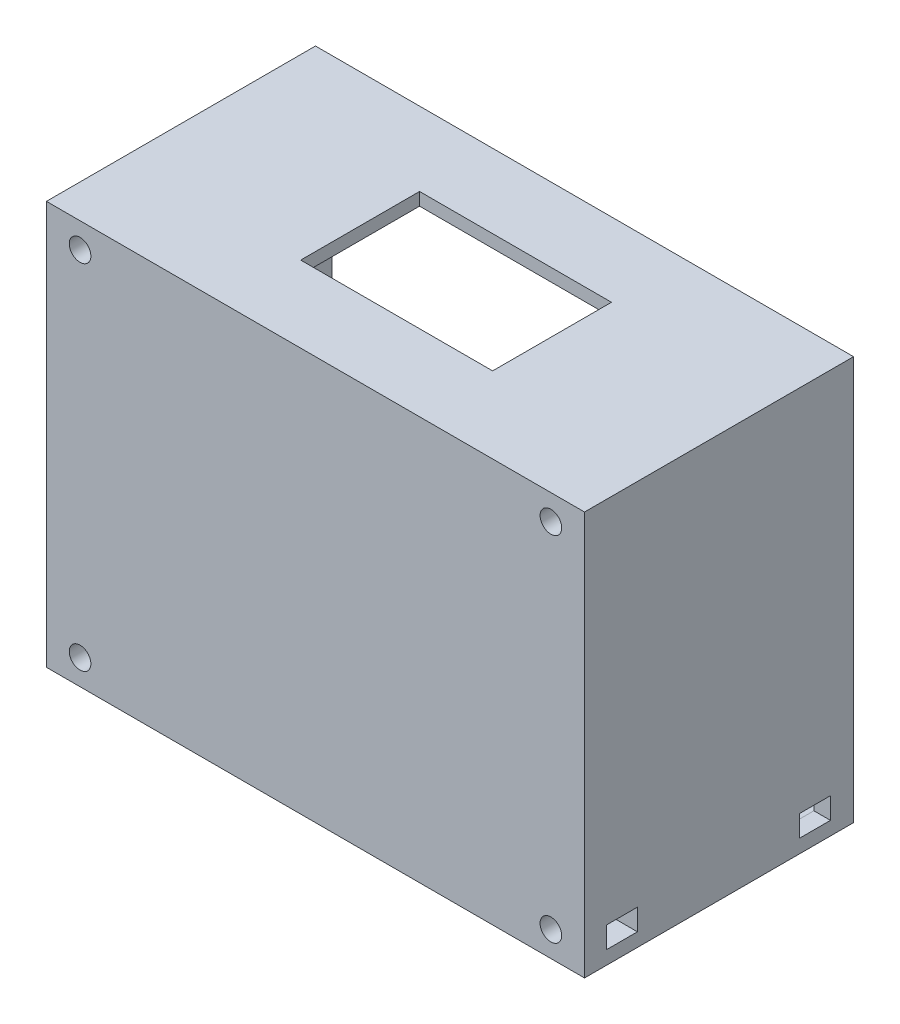
ISO-10303-21;
HEADER;
FILE_DESCRIPTION(('STEP AP214'),'2;1');
FILE_NAME('part.step','',(''),(''),'','','');
FILE_SCHEMA(('AUTOMOTIVE_DESIGN { 1 0 10303 214 1 1 1 1 }'));
ENDSEC;
DATA;
#1=APPLICATION_CONTEXT('core data for automotive mechanical design processes');
#2=APPLICATION_PROTOCOL_DEFINITION('international standard','automotive_design',2000,#1);
#3=PRODUCT_CONTEXT('',#1,'mechanical');
#4=PRODUCT('Part','Part','',(#3));
#5=PRODUCT_RELATED_PRODUCT_CATEGORY('part','',(#4));
#6=PRODUCT_DEFINITION_FORMATION('','',#4);
#7=PRODUCT_DEFINITION_CONTEXT('part definition',#1,'design');
#8=PRODUCT_DEFINITION('design','',#6,#7);
#9=PRODUCT_DEFINITION_SHAPE('','',#8);
#10=(LENGTH_UNIT() NAMED_UNIT(*) SI_UNIT(.MILLI.,.METRE.));
#11=(NAMED_UNIT(*) PLANE_ANGLE_UNIT() SI_UNIT($,.RADIAN.));
#12=(NAMED_UNIT(*) SI_UNIT($,.STERADIAN.) SOLID_ANGLE_UNIT());
#13=UNCERTAINTY_MEASURE_WITH_UNIT(LENGTH_MEASURE(1.E-05),#10,'distance_accuracy_value','');
#14=(GEOMETRIC_REPRESENTATION_CONTEXT(3) GLOBAL_UNCERTAINTY_ASSIGNED_CONTEXT((#13)) GLOBAL_UNIT_ASSIGNED_CONTEXT((#10,
#11,#12)) REPRESENTATION_CONTEXT('',''));
#15=CARTESIAN_POINT('',(0.,0.,0.));
#16=DIRECTION('',(0.,0.,1.));
#17=DIRECTION('',(1.,0.,0.));
#18=AXIS2_PLACEMENT_3D('',#15,#16,#17);
#19=CARTESIAN_POINT('',(100.,-75.,100.));
#20=DIRECTION('',(-1.,0.,0.));
#21=DIRECTION('',(0.,-1.,0.));
#22=AXIS2_PLACEMENT_3D('',#19,#20,#21);
#23=PLANE('',#22);
#24=DIRECTION('',(0.,-1.,0.));
#25=VECTOR('',#24,1.);
#26=CARTESIAN_POINT('',(100.,-75.,20.0891377684117));
#27=LINE('',#26,#25);
#28=CARTESIAN_POINT('',(100.,-62.0179765850764,20.0891377684117));
#29=VERTEX_POINT('',#28);
#30=CARTESIAN_POINT('',(100.,-69.9663175976663,20.0891377684117));
#31=VERTEX_POINT('',#30);
#32=EDGE_CURVE('E285',#29,#31,#27,.T.);
#33=ORIENTED_EDGE('',*,*,#32,.F.);
#34=DIRECTION('',(0.,0.,1.));
#35=VECTOR('',#34,1.);
#36=CARTESIAN_POINT('',(100.,-62.0179765850764,100.));
#37=LINE('',#36,#35);
#38=CARTESIAN_POINT('',(100.,-62.0179765850764,8.58495998703163));
#39=VERTEX_POINT('',#38);
#40=EDGE_CURVE('E269',#39,#29,#37,.T.);
#41=ORIENTED_EDGE('',*,*,#40,.F.);
#42=DIRECTION('',(0.,1.,0.));
#43=VECTOR('',#42,1.);
#44=CARTESIAN_POINT('',(100.,-75.,8.58495998703163));
#45=LINE('',#44,#43);
#46=CARTESIAN_POINT('',(100.,-69.9663175976663,8.58495998703163));
#47=VERTEX_POINT('',#46);
#48=EDGE_CURVE('E280',#47,#39,#45,.T.);
#49=ORIENTED_EDGE('',*,*,#48,.F.);
#50=DIRECTION('',(0.,0.,-1.));
#51=VECTOR('',#50,1.);
#52=CARTESIAN_POINT('',(100.,-69.9663175976663,100.));
#53=LINE('',#52,#51);
#54=EDGE_CURVE('E283',#31,#47,#53,.T.);
#55=ORIENTED_EDGE('',*,*,#54,.F.);
#56=EDGE_LOOP('',(#33,#41,#49,#55));
#57=FACE_BOUND('',#56,.T.);
#58=DIRECTION('',(0.,1.,0.));
#59=VECTOR('',#58,1.);
#60=CARTESIAN_POINT('',(100.,-75.,0.));
#61=LINE('',#60,#59);
#62=CARTESIAN_POINT('',(100.,-75.,0.));
#63=VERTEX_POINT('',#62);
#64=CARTESIAN_POINT('',(99.9999999999999,75.,0.));
#65=VERTEX_POINT('',#64);
#66=EDGE_CURVE('E396',#63,#65,#61,.T.);
#67=ORIENTED_EDGE('',*,*,#66,.T.);
#68=DIRECTION('',(0.,0.,-1.));
#69=VECTOR('',#68,1.);
#70=CARTESIAN_POINT('',(99.9999999999999,75.,100.));
#71=LINE('',#70,#69);
#72=CARTESIAN_POINT('',(99.9999999999999,75.,100.));
#73=VERTEX_POINT('',#72);
#74=EDGE_CURVE('E401',#73,#65,#71,.T.);
#75=ORIENTED_EDGE('',*,*,#74,.F.);
#76=DIRECTION('',(0.,1.,0.));
#77=VECTOR('',#76,1.);
#78=CARTESIAN_POINT('',(100.,-75.,100.));
#79=LINE('',#78,#77);
#80=CARTESIAN_POINT('',(100.,-75.,100.));
#81=VERTEX_POINT('',#80);
#82=EDGE_CURVE('E387',#81,#73,#79,.T.);
#83=ORIENTED_EDGE('',*,*,#82,.F.);
#84=DIRECTION('',(0.,0.,-1.));
#85=VECTOR('',#84,1.);
#86=CARTESIAN_POINT('',(100.,-75.,100.));
#87=LINE('',#86,#85);
#88=EDGE_CURVE('E404',#81,#63,#87,.T.);
#89=ORIENTED_EDGE('',*,*,#88,.T.);
#90=EDGE_LOOP('',(#67,#75,#83,#89));
#91=FACE_BOUND('',#90,.T.);
#92=DIRECTION('',(0.,-1.,0.));
#93=VECTOR('',#92,1.);
#94=CARTESIAN_POINT('',(100.,-75.,91.833373750473));
#95=LINE('',#94,#93);
#96=CARTESIAN_POINT('',(100.,-62.0179765850764,91.833373750473));
#97=VERTEX_POINT('',#96);
#98=CARTESIAN_POINT('',(100.,-69.9663175976663,91.833373750473));
#99=VERTEX_POINT('',#98);
#100=EDGE_CURVE('E292',#97,#99,#95,.T.);
#101=ORIENTED_EDGE('',*,*,#100,.F.);
#102=DIRECTION('',(0.,0.,1.));
#103=VECTOR('',#102,1.);
#104=CARTESIAN_POINT('',(100.,-62.0179765850764,100.));
#105=LINE('',#104,#103);
#106=CARTESIAN_POINT('',(100.,-62.0179765850764,80.329195969093));
#107=VERTEX_POINT('',#106);
#108=EDGE_CURVE('E287',#107,#97,#105,.T.);
#109=ORIENTED_EDGE('',*,*,#108,.F.);
#110=DIRECTION('',(0.,1.,0.));
#111=VECTOR('',#110,1.);
#112=CARTESIAN_POINT('',(100.,-75.,80.329195969093));
#113=LINE('',#112,#111);
#114=CARTESIAN_POINT('',(100.,-69.9663175976663,80.329195969093));
#115=VERTEX_POINT('',#114);
#116=EDGE_CURVE('E289',#115,#107,#113,.T.);
#117=ORIENTED_EDGE('',*,*,#116,.F.);
#118=DIRECTION('',(0.,0.,-1.));
#119=VECTOR('',#118,1.);
#120=CARTESIAN_POINT('',(100.,-69.9663175976663,100.));
#121=LINE('',#120,#119);
#122=EDGE_CURVE('E448',#99,#115,#121,.T.);
#123=ORIENTED_EDGE('',*,*,#122,.F.);
#124=EDGE_LOOP('',(#101,#109,#117,#123));
#125=FACE_BOUND('',#124,.T.);
#126=ADVANCED_FACE('F33',(#57,#91,#125),#23,.F.);
#127=CARTESIAN_POINT('',(87.5007308465081,-65.625548134881,100.));
#128=DIRECTION('',(0.,0.,-1.));
#129=DIRECTION('',(-1.,0.,0.));
#130=AXIS2_PLACEMENT_3D('',#127,#128,#129);
#131=CYLINDRICAL_SURFACE('',#130,4.0159317030488);
#132=CARTESIAN_POINT('',(87.5007308465081,-65.625548134881,80.));
#133=DIRECTION('',(0.,0.,1.));
#134=DIRECTION('',(1.,0.,0.));
#135=AXIS2_PLACEMENT_3D('',#132,#133,#134);
#136=CIRCLE('',#135,4.0159317030488);
#137=CARTESIAN_POINT('',(91.5166625495569,-65.625548134881,80.));
#138=VERTEX_POINT('',#137);
#139=EDGE_CURVE('E358',#138,#138,#136,.T.);
#140=ORIENTED_EDGE('',*,*,#139,.F.);
#141=EDGE_LOOP('',(#140));
#142=FACE_BOUND('',#141,.T.);
#143=CARTESIAN_POINT('',(87.5007308465081,-65.625548134881,100.));
#144=DIRECTION('',(0.,0.,1.));
#145=DIRECTION('',(1.,0.,0.));
#146=AXIS2_PLACEMENT_3D('',#143,#144,#145);
#147=CIRCLE('',#146,4.0159317030488);
#148=CARTESIAN_POINT('',(91.5166625495569,-65.625548134881,100.));
#149=VERTEX_POINT('',#148);
#150=EDGE_CURVE('E368',#149,#149,#147,.T.);
#151=ORIENTED_EDGE('',*,*,#150,.T.);
#152=EDGE_LOOP('',(#151));
#153=FACE_BOUND('',#152,.T.);
#154=CARTESIAN_POINT('',(87.5007308465081,-65.625548134881,91.833373750473));
#155=DIRECTION('',(0.,0.,-1.));
#156=DIRECTION('',(-1.,0.,0.));
#157=AXIS2_PLACEMENT_3D('',#154,#155,#156);
#158=CIRCLE('',#157,4.0159317030488);
#159=CARTESIAN_POINT('',(89.2651386668808,-62.0179765850764,91.833373750473));
#160=VERTEX_POINT('',#159);
#161=CARTESIAN_POINT('',(85.7363230261354,-62.0179765850764,91.833373750473));
#162=VERTEX_POINT('',#161);
#163=EDGE_CURVE('E442',#160,#162,#158,.T.);
#164=ORIENTED_EDGE('',*,*,#163,.T.);
#165=DIRECTION('',(0.,0.,-1.));
#166=VECTOR('',#165,1.);
#167=CARTESIAN_POINT('',(85.7363230261354,-62.0179765850764,100.));
#168=LINE('',#167,#166);
#169=CARTESIAN_POINT('',(85.7363230261354,-62.0179765850764,80.329195969093));
#170=VERTEX_POINT('',#169);
#171=EDGE_CURVE('E445',#162,#170,#168,.T.);
#172=ORIENTED_EDGE('',*,*,#171,.T.);
#173=CARTESIAN_POINT('',(87.5007308465081,-65.625548134881,80.329195969093));
#174=DIRECTION('',(0.,0.,1.));
#175=DIRECTION('',(1.,0.,0.));
#176=AXIS2_PLACEMENT_3D('',#173,#174,#175);
#177=CIRCLE('',#176,4.0159317030488);
#178=CARTESIAN_POINT('',(89.2651386668808,-62.0179765850764,80.329195969093));
#179=VERTEX_POINT('',#178);
#180=EDGE_CURVE('E439',#170,#179,#177,.T.);
#181=ORIENTED_EDGE('',*,*,#180,.T.);
#182=DIRECTION('',(0.,0.,-1.));
#183=VECTOR('',#182,1.);
#184=CARTESIAN_POINT('',(89.2651386668808,-62.0179765850764,100.));
#185=LINE('',#184,#183);
#186=EDGE_CURVE('E436',#179,#160,#185,.F.);
#187=ORIENTED_EDGE('',*,*,#186,.T.);
#188=EDGE_LOOP('',(#164,#172,#181,#187));
#189=FACE_BOUND('',#188,.T.);
#190=ADVANCED_FACE('F474',(#142,#153,#189),#131,.F.);
#191=CARTESIAN_POINT('',(93.8350179720571,-70.2651693113456,80.));
#192=DIRECTION('',(-1.,0.,0.));
#193=DIRECTION('',(0.,0.,1.));
#194=AXIS2_PLACEMENT_3D('',#191,#192,#193);
#195=PLANE('',#194);
#196=DIRECTION('',(0.,1.,0.));
#197=VECTOR('',#196,1.);
#198=CARTESIAN_POINT('',(93.8350179720571,-70.2651693113456,0.));
#199=LINE('',#198,#197);
#200=CARTESIAN_POINT('',(93.8350179720571,-70.2651693113456,0.));
#201=VERTEX_POINT('',#200);
#202=CARTESIAN_POINT('',(93.8350179720571,70.2651693113456,0.));
#203=VERTEX_POINT('',#202);
#204=EDGE_CURVE('E343',#201,#203,#199,.T.);
#205=ORIENTED_EDGE('',*,*,#204,.F.);
#206=DIRECTION('',(0.,0.,-1.));
#207=VECTOR('',#206,1.);
#208=CARTESIAN_POINT('',(93.8350179720571,-70.2651693113456,80.));
#209=LINE('',#208,#207);
#210=CARTESIAN_POINT('',(93.8350179720571,-70.2651693113456,80.));
#211=VERTEX_POINT('',#210);
#212=EDGE_CURVE('E352',#211,#201,#209,.T.);
#213=ORIENTED_EDGE('',*,*,#212,.F.);
#214=DIRECTION('',(0.,1.,0.));
#215=VECTOR('',#214,1.);
#216=CARTESIAN_POINT('',(93.8350179720571,-70.2651693113456,80.));
#217=LINE('',#216,#215);
#218=CARTESIAN_POINT('',(93.8350179720571,70.2651693113456,80.));
#219=VERTEX_POINT('',#218);
#220=EDGE_CURVE('E333',#211,#219,#217,.T.);
#221=ORIENTED_EDGE('',*,*,#220,.T.);
#222=DIRECTION('',(0.,0.,-1.));
#223=VECTOR('',#222,1.);
#224=CARTESIAN_POINT('',(93.8350179720571,70.2651693113456,80.));
#225=LINE('',#224,#223);
#226=EDGE_CURVE('E350',#219,#203,#225,.T.);
#227=ORIENTED_EDGE('',*,*,#226,.T.);
#228=EDGE_LOOP('',(#205,#213,#221,#227));
#229=FACE_BOUND('',#228,.T.);
#230=DIRECTION('',(0.,0.,1.));
#231=VECTOR('',#230,1.);
#232=CARTESIAN_POINT('',(93.8350179720571,-62.0179765850764,80.));
#233=LINE('',#232,#231);
#234=CARTESIAN_POINT('',(93.8350179720571,-62.0179765850764,8.58495998703163));
#235=VERTEX_POINT('',#234);
#236=CARTESIAN_POINT('',(93.8350179720571,-62.0179765850764,20.0891377684117));
#237=VERTEX_POINT('',#236);
#238=EDGE_CURVE('E424',#235,#237,#233,.T.);
#239=ORIENTED_EDGE('',*,*,#238,.T.);
#240=DIRECTION('',(0.,-1.,0.));
#241=VECTOR('',#240,1.);
#242=CARTESIAN_POINT('',(93.8350179720571,-70.2651693113456,20.0891377684117));
#243=LINE('',#242,#241);
#244=CARTESIAN_POINT('',(93.8350179720571,-69.9663175976663,20.0891377684117));
#245=VERTEX_POINT('',#244);
#246=EDGE_CURVE('E433',#237,#245,#243,.T.);
#247=ORIENTED_EDGE('',*,*,#246,.T.);
#248=DIRECTION('',(0.,0.,-1.));
#249=VECTOR('',#248,1.);
#250=CARTESIAN_POINT('',(93.8350179720571,-69.9663175976663,80.));
#251=LINE('',#250,#249);
#252=CARTESIAN_POINT('',(93.8350179720571,-69.9663175976663,8.58495998703163));
#253=VERTEX_POINT('',#252);
#254=EDGE_CURVE('E430',#245,#253,#251,.T.);
#255=ORIENTED_EDGE('',*,*,#254,.T.);
#256=DIRECTION('',(0.,1.,0.));
#257=VECTOR('',#256,1.);
#258=CARTESIAN_POINT('',(93.8350179720571,-70.2651693113456,8.58495998703163));
#259=LINE('',#258,#257);
#260=EDGE_CURVE('E427',#253,#235,#259,.T.);
#261=ORIENTED_EDGE('',*,*,#260,.T.);
#262=EDGE_LOOP('',(#239,#247,#255,#261));
#263=FACE_BOUND('',#262,.T.);
#264=ADVANCED_FACE('F480',(#229,#263),#195,.T.);
#265=CARTESIAN_POINT('',(0.,0.,0.));
#266=DIRECTION('',(0.,0.,1.));
#267=DIRECTION('',(1.,0.,0.));
#268=AXIS2_PLACEMENT_3D('',#265,#266,#267);
#269=PLANE('',#268);
#270=DIRECTION('',(0.,-1.,0.));
#271=VECTOR('',#270,1.);
#272=CARTESIAN_POINT('',(-100.,-75.,0.));
#273=LINE('',#272,#271);
#274=CARTESIAN_POINT('',(-100.,75.,0.));
#275=VERTEX_POINT('',#274);
#276=CARTESIAN_POINT('',(-100.,-75.,0.));
#277=VERTEX_POINT('',#276);
#278=EDGE_CURVE('E380',#275,#277,#273,.T.);
#279=ORIENTED_EDGE('',*,*,#278,.F.);
#280=DIRECTION('',(-1.,0.,0.));
#281=VECTOR('',#280,1.);
#282=CARTESIAN_POINT('',(99.9999999999999,75.,0.));
#283=LINE('',#282,#281);
#284=EDGE_CURVE('E385',#65,#275,#283,.T.);
#285=ORIENTED_EDGE('',*,*,#284,.F.);
#286=ORIENTED_EDGE('',*,*,#66,.F.);
#287=DIRECTION('',(1.,0.,0.));
#288=VECTOR('',#287,1.);
#289=CARTESIAN_POINT('',(100.,-75.,0.));
#290=LINE('',#289,#288);
#291=EDGE_CURVE('E394',#277,#63,#290,.T.);
#292=ORIENTED_EDGE('',*,*,#291,.F.);
#293=EDGE_LOOP('',(#279,#285,#286,#292));
#294=FACE_BOUND('',#293,.T.);
#295=DIRECTION('',(0.,-1.,0.));
#296=VECTOR('',#295,1.);
#297=CARTESIAN_POINT('',(-93.8350179720571,-70.2651693113456,0.));
#298=LINE('',#297,#296);
#299=CARTESIAN_POINT('',(-93.8350179720571,70.2651693113456,0.));
#300=VERTEX_POINT('',#299);
#301=CARTESIAN_POINT('',(-93.8350179720571,-70.2651693113456,0.));
#302=VERTEX_POINT('',#301);
#303=EDGE_CURVE('E326',#300,#302,#298,.T.);
#304=ORIENTED_EDGE('',*,*,#303,.T.);
#305=DIRECTION('',(1.,0.,0.));
#306=VECTOR('',#305,1.);
#307=CARTESIAN_POINT('',(93.8350179720571,-70.2651693113456,0.));
#308=LINE('',#307,#306);
#309=EDGE_CURVE('E340',#302,#201,#308,.T.);
#310=ORIENTED_EDGE('',*,*,#309,.T.);
#311=ORIENTED_EDGE('',*,*,#204,.T.);
#312=DIRECTION('',(-1.,0.,0.));
#313=VECTOR('',#312,1.);
#314=CARTESIAN_POINT('',(93.8350179720571,70.2651693113456,0.));
#315=LINE('',#314,#313);
#316=EDGE_CURVE('E331',#203,#300,#315,.T.);
#317=ORIENTED_EDGE('',*,*,#316,.T.);
#318=EDGE_LOOP('',(#304,#310,#311,#317));
#319=FACE_BOUND('',#318,.T.);
#320=ADVANCED_FACE('F506',(#294,#319),#269,.F.);
#321=CARTESIAN_POINT('',(0.,0.,100.));
#322=DIRECTION('',(0.,0.,1.));
#323=DIRECTION('',(1.,0.,0.));
#324=AXIS2_PLACEMENT_3D('',#321,#322,#323);
#325=PLANE('',#324);
#326=CARTESIAN_POINT('',(87.5007308465081,65.625548134881,100.));
#327=DIRECTION('',(0.,0.,1.));
#328=DIRECTION('',(-1.,0.,0.));
#329=AXIS2_PLACEMENT_3D('',#326,#327,#328);
#330=CIRCLE('',#329,4.0159317030488);
#331=CARTESIAN_POINT('',(83.4847991434593,65.625548134881,100.));
#332=VERTEX_POINT('',#331);
#333=EDGE_CURVE('E371',#332,#332,#330,.T.);
#334=ORIENTED_EDGE('',*,*,#333,.F.);
#335=EDGE_LOOP('',(#334));
#336=FACE_BOUND('',#335,.T.);
#337=CARTESIAN_POINT('',(-87.5007308465081,65.625548134881,100.));
#338=DIRECTION('',(0.,0.,1.));
#339=DIRECTION('',(1.,0.,0.));
#340=AXIS2_PLACEMENT_3D('',#337,#338,#339);
#341=CIRCLE('',#340,4.0159317030488);
#342=CARTESIAN_POINT('',(-83.4847991434593,65.625548134881,100.));
#343=VERTEX_POINT('',#342);
#344=EDGE_CURVE('E377',#343,#343,#341,.T.);
#345=ORIENTED_EDGE('',*,*,#344,.F.);
#346=EDGE_LOOP('',(#345));
#347=FACE_BOUND('',#346,.T.);
#348=DIRECTION('',(0.,-1.,0.));
#349=VECTOR('',#348,1.);
#350=CARTESIAN_POINT('',(-100.,-75.,100.));
#351=LINE('',#350,#349);
#352=CARTESIAN_POINT('',(-100.,75.,100.));
#353=VERTEX_POINT('',#352);
#354=CARTESIAN_POINT('',(-100.,-75.,100.));
#355=VERTEX_POINT('',#354);
#356=EDGE_CURVE('E381',#353,#355,#351,.T.);
#357=ORIENTED_EDGE('',*,*,#356,.T.);
#358=DIRECTION('',(1.,0.,0.));
#359=VECTOR('',#358,1.);
#360=CARTESIAN_POINT('',(100.,-75.,100.));
#361=LINE('',#360,#359);
#362=EDGE_CURVE('E384',#355,#81,#361,.T.);
#363=ORIENTED_EDGE('',*,*,#362,.T.);
#364=ORIENTED_EDGE('',*,*,#82,.T.);
#365=DIRECTION('',(-1.,0.,0.));
#366=VECTOR('',#365,1.);
#367=CARTESIAN_POINT('',(99.9999999999999,75.,100.));
#368=LINE('',#367,#366);
#369=EDGE_CURVE('E389',#73,#353,#368,.T.);
#370=ORIENTED_EDGE('',*,*,#369,.T.);
#371=EDGE_LOOP('',(#357,#363,#364,#370));
#372=FACE_BOUND('',#371,.T.);
#373=CARTESIAN_POINT('',(-87.5007308465081,-65.6255481348811,100.));
#374=DIRECTION('',(0.,0.,1.));
#375=DIRECTION('',(-1.,0.,0.));
#376=AXIS2_PLACEMENT_3D('',#373,#374,#375);
#377=CIRCLE('',#376,4.0159317030488);
#378=CARTESIAN_POINT('',(-91.5166625495569,-65.6255481348811,100.));
#379=VERTEX_POINT('',#378);
#380=EDGE_CURVE('E374',#379,#379,#377,.T.);
#381=ORIENTED_EDGE('',*,*,#380,.F.);
#382=EDGE_LOOP('',(#381));
#383=FACE_BOUND('',#382,.T.);
#384=ORIENTED_EDGE('',*,*,#150,.F.);
#385=EDGE_LOOP('',(#384));
#386=FACE_BOUND('',#385,.T.);
#387=ADVANCED_FACE('F495',(#336,#347,#372,#383,#386),#325,.T.);
#388=CARTESIAN_POINT('',(-100.,-75.,100.));
#389=DIRECTION('',(1.,0.,0.));
#390=DIRECTION('',(0.,0.,-1.));
#391=AXIS2_PLACEMENT_3D('',#388,#389,#390);
#392=PLANE('',#391);
#393=DIRECTION('',(0.,0.,1.));
#394=VECTOR('',#393,1.);
#395=CARTESIAN_POINT('',(-100.,-61.3904759788193,100.));
#396=LINE('',#395,#394);
#397=CARTESIAN_POINT('',(-100.,-61.3904759788193,7.95745938077452));
#398=VERTEX_POINT('',#397);
#399=CARTESIAN_POINT('',(-100.,-61.3904759788193,33.6849842373155));
#400=VERTEX_POINT('',#399);
#401=EDGE_CURVE('E323',#398,#400,#396,.T.);
#402=ORIENTED_EDGE('',*,*,#401,.T.);
#403=DIRECTION('',(0.,-1.,0.));
#404=VECTOR('',#403,1.);
#405=CARTESIAN_POINT('',(-100.,-75.,33.6849842373155));
#406=LINE('',#405,#404);
#407=CARTESIAN_POINT('',(-100.,-70.384651335171,33.6849842373155));
#408=VERTEX_POINT('',#407);
#409=EDGE_CURVE('E320',#400,#408,#406,.T.);
#410=ORIENTED_EDGE('',*,*,#409,.T.);
#411=DIRECTION('',(0.,0.,-1.));
#412=VECTOR('',#411,1.);
#413=CARTESIAN_POINT('',(-100.,-70.384651335171,100.));
#414=LINE('',#413,#412);
#415=CARTESIAN_POINT('',(-100.,-70.384651335171,7.95745938077452));
#416=VERTEX_POINT('',#415);
#417=EDGE_CURVE('E421',#408,#416,#414,.T.);
#418=ORIENTED_EDGE('',*,*,#417,.T.);
#419=DIRECTION('',(0.,1.,0.));
#420=VECTOR('',#419,1.);
#421=CARTESIAN_POINT('',(-100.,-75.,7.95745938077452));
#422=LINE('',#421,#420);
#423=EDGE_CURVE('E315',#416,#398,#422,.T.);
#424=ORIENTED_EDGE('',*,*,#423,.T.);
#425=EDGE_LOOP('',(#402,#410,#418,#424));
#426=FACE_BOUND('',#425,.T.);
#427=ORIENTED_EDGE('',*,*,#278,.T.);
#428=DIRECTION('',(0.,0.,-1.));
#429=VECTOR('',#428,1.);
#430=CARTESIAN_POINT('',(-100.,-75.,100.));
#431=LINE('',#430,#429);
#432=EDGE_CURVE('E407',#355,#277,#431,.T.);
#433=ORIENTED_EDGE('',*,*,#432,.F.);
#434=ORIENTED_EDGE('',*,*,#356,.F.);
#435=DIRECTION('',(0.,0.,-1.));
#436=VECTOR('',#435,1.);
#437=CARTESIAN_POINT('',(-100.,75.,100.));
#438=LINE('',#437,#436);
#439=EDGE_CURVE('E391',#353,#275,#438,.T.);
#440=ORIENTED_EDGE('',*,*,#439,.T.);
#441=EDGE_LOOP('',(#427,#433,#434,#440));
#442=FACE_BOUND('',#441,.T.);
#443=ADVANCED_FACE('F35',(#426,#442),#392,.F.);
#444=CARTESIAN_POINT('',(100.,-75.,100.));
#445=DIRECTION('',(0.,1.,0.));
#446=DIRECTION('',(-1.,0.,0.));
#447=AXIS2_PLACEMENT_3D('',#444,#445,#446);
#448=PLANE('',#447);
#449=ORIENTED_EDGE('',*,*,#291,.T.);
#450=ORIENTED_EDGE('',*,*,#88,.F.);
#451=ORIENTED_EDGE('',*,*,#362,.F.);
#452=ORIENTED_EDGE('',*,*,#432,.T.);
#453=EDGE_LOOP('',(#449,#450,#451,#452));
#454=FACE_BOUND('',#453,.T.);
#455=ADVANCED_FACE('F487',(#454),#448,.F.);
#456=CARTESIAN_POINT('',(99.9999999999999,75.,100.));
#457=DIRECTION('',(0.,-1.,0.));
#458=DIRECTION('',(1.,0.,0.));
#459=AXIS2_PLACEMENT_3D('',#456,#457,#458);
#460=PLANE('',#459);
#461=DIRECTION('',(1.,0.,0.));
#462=VECTOR('',#461,1.);
#463=CARTESIAN_POINT('',(-33.8343256181856,75.,71.6582785008126));
#464=LINE('',#463,#462);
#465=CARTESIAN_POINT('',(-33.8343256181856,75.,71.6582785008126));
#466=VERTEX_POINT('',#465);
#467=CARTESIAN_POINT('',(37.4979150163332,75.,71.6582785008126));
#468=VERTEX_POINT('',#467);
#469=EDGE_CURVE('E229',#466,#468,#464,.T.);
#470=ORIENTED_EDGE('',*,*,#469,.F.);
#471=DIRECTION('',(0.,0.,1.));
#472=VECTOR('',#471,1.);
#473=CARTESIAN_POINT('',(-33.8343256181856,75.,27.4797004643281));
#474=LINE('',#473,#472);
#475=CARTESIAN_POINT('',(-33.8343256181856,75.,27.4797004643281));
#476=VERTEX_POINT('',#475);
#477=EDGE_CURVE('E48',#476,#466,#474,.T.);
#478=ORIENTED_EDGE('',*,*,#477,.F.);
#479=DIRECTION('',(-1.,0.,0.));
#480=VECTOR('',#479,1.);
#481=CARTESIAN_POINT('',(-33.8343256181856,75.,27.4797004643281));
#482=LINE('',#481,#480);
#483=CARTESIAN_POINT('',(37.4979150163332,75.,27.4797004643281));
#484=VERTEX_POINT('',#483);
#485=EDGE_CURVE('E236',#484,#476,#482,.T.);
#486=ORIENTED_EDGE('',*,*,#485,.F.);
#487=DIRECTION('',(0.,0.,-1.));
#488=VECTOR('',#487,1.);
#489=CARTESIAN_POINT('',(37.4979150163332,75.,27.4797004643281));
#490=LINE('',#489,#488);
#491=EDGE_CURVE('E220',#468,#484,#490,.T.);
#492=ORIENTED_EDGE('',*,*,#491,.F.);
#493=EDGE_LOOP('',(#470,#478,#486,#492));
#494=FACE_BOUND('',#493,.T.);
#495=ORIENTED_EDGE('',*,*,#284,.T.);
#496=ORIENTED_EDGE('',*,*,#439,.F.);
#497=ORIENTED_EDGE('',*,*,#369,.F.);
#498=ORIENTED_EDGE('',*,*,#74,.T.);
#499=EDGE_LOOP('',(#495,#496,#497,#498));
#500=FACE_BOUND('',#499,.T.);
#501=ADVANCED_FACE('F233',(#494,#500),#460,.F.);
#502=CARTESIAN_POINT('',(-87.5007308465081,65.625548134881,100.));
#503=DIRECTION('',(0.,0.,-1.));
#504=DIRECTION('',(-1.,0.,0.));
#505=AXIS2_PLACEMENT_3D('',#502,#503,#504);
#506=CYLINDRICAL_SURFACE('',#505,4.0159317030488);
#507=CARTESIAN_POINT('',(-87.5007308465081,65.625548134881,80.));
#508=DIRECTION('',(0.,0.,1.));
#509=DIRECTION('',(1.,0.,0.));
#510=AXIS2_PLACEMENT_3D('',#507,#508,#509);
#511=CIRCLE('',#510,4.0159317030488);
#512=CARTESIAN_POINT('',(-83.4847991434593,65.625548134881,80.));
#513=VERTEX_POINT('',#512);
#514=EDGE_CURVE('E365',#513,#513,#511,.T.);
#515=ORIENTED_EDGE('',*,*,#514,.F.);
#516=EDGE_LOOP('',(#515));
#517=FACE_BOUND('',#516,.T.);
#518=ORIENTED_EDGE('',*,*,#344,.T.);
#519=EDGE_LOOP('',(#518));
#520=FACE_BOUND('',#519,.T.);
#521=ADVANCED_FACE('F494',(#517,#520),#506,.F.);
#522=CARTESIAN_POINT('',(-87.5007308465081,-65.6255481348811,100.));
#523=DIRECTION('',(0.,0.,-1.));
#524=DIRECTION('',(-1.,0.,0.));
#525=AXIS2_PLACEMENT_3D('',#522,#523,#524);
#526=CYLINDRICAL_SURFACE('',#525,4.0159317030488);
#527=CARTESIAN_POINT('',(-87.5007308465081,-65.6255481348811,80.));
#528=DIRECTION('',(0.,0.,1.));
#529=DIRECTION('',(1.,0.,0.));
#530=AXIS2_PLACEMENT_3D('',#527,#528,#529);
#531=CIRCLE('',#530,4.0159317030488);
#532=CARTESIAN_POINT('',(-83.4847991434593,-65.6255481348811,80.));
#533=VERTEX_POINT('',#532);
#534=EDGE_CURVE('E362',#533,#533,#531,.T.);
#535=ORIENTED_EDGE('',*,*,#534,.F.);
#536=EDGE_LOOP('',(#535));
#537=FACE_BOUND('',#536,.T.);
#538=ORIENTED_EDGE('',*,*,#380,.T.);
#539=EDGE_LOOP('',(#538));
#540=FACE_BOUND('',#539,.T.);
#541=ADVANCED_FACE('F611',(#537,#540),#526,.F.);
#542=CARTESIAN_POINT('',(87.5007308465081,65.625548134881,100.));
#543=DIRECTION('',(0.,0.,-1.));
#544=DIRECTION('',(-1.,0.,0.));
#545=AXIS2_PLACEMENT_3D('',#542,#543,#544);
#546=CYLINDRICAL_SURFACE('',#545,4.0159317030488);
#547=CARTESIAN_POINT('',(87.5007308465081,65.625548134881,80.));
#548=DIRECTION('',(0.,0.,1.));
#549=DIRECTION('',(1.,0.,0.));
#550=AXIS2_PLACEMENT_3D('',#547,#548,#549);
#551=CIRCLE('',#550,4.0159317030488);
#552=CARTESIAN_POINT('',(91.5166625495569,65.625548134881,80.));
#553=VERTEX_POINT('',#552);
#554=EDGE_CURVE('E359',#553,#553,#551,.T.);
#555=ORIENTED_EDGE('',*,*,#554,.F.);
#556=EDGE_LOOP('',(#555));
#557=FACE_BOUND('',#556,.T.);
#558=ORIENTED_EDGE('',*,*,#333,.T.);
#559=EDGE_LOOP('',(#558));
#560=FACE_BOUND('',#559,.T.);
#561=ADVANCED_FACE('F606',(#557,#560),#546,.F.);
#562=CARTESIAN_POINT('',(-93.8350179720571,-70.2651693113456,80.));
#563=DIRECTION('',(1.,0.,0.));
#564=DIRECTION('',(0.,0.,-1.));
#565=AXIS2_PLACEMENT_3D('',#562,#563,#564);
#566=PLANE('',#565);
#567=DIRECTION('',(0.,-1.,0.));
#568=VECTOR('',#567,1.);
#569=CARTESIAN_POINT('',(-93.8350179720571,-70.2651693113456,33.6849842373155));
#570=LINE('',#569,#568);
#571=CARTESIAN_POINT('',(-93.8350179720571,-61.3904759788193,33.6849842373155));
#572=VERTEX_POINT('',#571);
#573=CARTESIAN_POINT('',(-93.8350179720571,-70.2651693113456,33.6849842373155));
#574=VERTEX_POINT('',#573);
#575=EDGE_CURVE('E318',#572,#574,#570,.T.);
#576=ORIENTED_EDGE('',*,*,#575,.F.);
#577=DIRECTION('',(0.,0.,1.));
#578=VECTOR('',#577,1.);
#579=CARTESIAN_POINT('',(-93.8350179720571,-61.3904759788193,80.));
#580=LINE('',#579,#578);
#581=CARTESIAN_POINT('',(-93.8350179720571,-61.3904759788193,7.95745938077452));
#582=VERTEX_POINT('',#581);
#583=EDGE_CURVE('E419',#582,#572,#580,.T.);
#584=ORIENTED_EDGE('',*,*,#583,.F.);
#585=DIRECTION('',(0.,1.,0.));
#586=VECTOR('',#585,1.);
#587=CARTESIAN_POINT('',(-93.8350179720571,-70.2651693113456,7.95745938077452));
#588=LINE('',#587,#586);
#589=CARTESIAN_POINT('',(-93.8350179720571,-70.2651693113456,7.95745938077452));
#590=VERTEX_POINT('',#589);
#591=EDGE_CURVE('E307',#590,#582,#588,.T.);
#592=ORIENTED_EDGE('',*,*,#591,.F.);
#593=DIRECTION('',(0.,0.,-1.));
#594=VECTOR('',#593,1.);
#595=CARTESIAN_POINT('',(-93.8350179720571,-70.2651693113456,80.));
#596=LINE('',#595,#594);
#597=EDGE_CURVE('E354',#590,#302,#596,.T.);
#598=ORIENTED_EDGE('',*,*,#597,.T.);
#599=ORIENTED_EDGE('',*,*,#303,.F.);
#600=DIRECTION('',(0.,0.,-1.));
#601=VECTOR('',#600,1.);
#602=CARTESIAN_POINT('',(-93.8350179720571,70.2651693113456,80.));
#603=LINE('',#602,#601);
#604=CARTESIAN_POINT('',(-93.8350179720571,70.2651693113456,80.));
#605=VERTEX_POINT('',#604);
#606=EDGE_CURVE('E337',#605,#300,#603,.T.);
#607=ORIENTED_EDGE('',*,*,#606,.F.);
#608=DIRECTION('',(0.,-1.,0.));
#609=VECTOR('',#608,1.);
#610=CARTESIAN_POINT('',(-93.8350179720571,-70.2651693113456,80.));
#611=LINE('',#610,#609);
#612=CARTESIAN_POINT('',(-93.8350179720571,-70.2651693113456,80.));
#613=VERTEX_POINT('',#612);
#614=EDGE_CURVE('E327',#605,#613,#611,.T.);
#615=ORIENTED_EDGE('',*,*,#614,.T.);
#616=EDGE_CURVE('E355',#613,#574,#596,.T.);
#617=ORIENTED_EDGE('',*,*,#616,.T.);
#618=EDGE_LOOP('',(#576,#584,#592,#598,#599,#607,#615,#617));
#619=FACE_BOUND('',#618,.T.);
#620=ADVANCED_FACE('F603',(#619),#566,.T.);
#621=CARTESIAN_POINT('',(93.8350179720571,-70.2651693113456,80.));
#622=DIRECTION('',(0.,1.,0.));
#623=DIRECTION('',(0.,0.,1.));
#624=AXIS2_PLACEMENT_3D('',#621,#622,#623);
#625=PLANE('',#624);
#626=DIRECTION('',(1.,0.,0.));
#627=VECTOR('',#626,1.);
#628=CARTESIAN_POINT('',(93.8350179720571,-70.2651693113456,33.6849842373155));
#629=LINE('',#628,#627);
#630=CARTESIAN_POINT('',(0.,-70.2651693113456,33.6849842373155));
#631=VERTEX_POINT('',#630);
#632=EDGE_CURVE('E416',#574,#631,#629,.T.);
#633=ORIENTED_EDGE('',*,*,#632,.F.);
#634=ORIENTED_EDGE('',*,*,#616,.F.);
#635=DIRECTION('',(1.,0.,0.));
#636=VECTOR('',#635,1.);
#637=CARTESIAN_POINT('',(93.8350179720571,-70.2651693113456,80.));
#638=LINE('',#637,#636);
#639=EDGE_CURVE('E330',#613,#211,#638,.T.);
#640=ORIENTED_EDGE('',*,*,#639,.T.);
#641=ORIENTED_EDGE('',*,*,#212,.T.);
#642=ORIENTED_EDGE('',*,*,#309,.F.);
#643=ORIENTED_EDGE('',*,*,#597,.F.);
#644=DIRECTION('',(-1.,0.,0.));
#645=VECTOR('',#644,1.);
#646=CARTESIAN_POINT('',(93.8350179720571,-70.2651693113456,7.95745938077452));
#647=LINE('',#646,#645);
#648=CARTESIAN_POINT('',(0.,-70.2651693113456,7.95745938077452));
#649=VERTEX_POINT('',#648);
#650=EDGE_CURVE('E414',#649,#590,#647,.T.);
#651=ORIENTED_EDGE('',*,*,#650,.F.);
#652=DIRECTION('',(0.,0.,-1.));
#653=VECTOR('',#652,1.);
#654=CARTESIAN_POINT('',(0.,-70.2651693113456,80.));
#655=LINE('',#654,#653);
#656=EDGE_CURVE('E410',#631,#649,#655,.T.);
#657=ORIENTED_EDGE('',*,*,#656,.F.);
#658=EDGE_LOOP('',(#633,#634,#640,#641,#642,#643,#651,#657));
#659=FACE_BOUND('',#658,.T.);
#660=ADVANCED_FACE('F597',(#659),#625,.T.);
#661=CARTESIAN_POINT('',(93.8350179720571,70.2651693113456,80.));
#662=DIRECTION('',(0.,-1.,0.));
#663=DIRECTION('',(0.,0.,-1.));
#664=AXIS2_PLACEMENT_3D('',#661,#662,#663);
#665=PLANE('',#664);
#666=DIRECTION('',(0.,0.,-1.));
#667=VECTOR('',#666,1.);
#668=CARTESIAN_POINT('',(-33.8343256181856,70.2651693113456,80.));
#669=LINE('',#668,#667);
#670=CARTESIAN_POINT('',(-33.8343256181856,70.2651693113456,71.6582785008126));
#671=VERTEX_POINT('',#670);
#672=CARTESIAN_POINT('',(-33.8343256181856,70.2651693113456,27.4797004643281));
#673=VERTEX_POINT('',#672);
#674=EDGE_CURVE('E11',#671,#673,#669,.T.);
#675=ORIENTED_EDGE('',*,*,#674,.F.);
#676=DIRECTION('',(-1.,0.,0.));
#677=VECTOR('',#676,1.);
#678=CARTESIAN_POINT('',(93.8350179720571,70.2651693113456,71.6582785008126));
#679=LINE('',#678,#677);
#680=CARTESIAN_POINT('',(37.4979150163332,70.2651693113456,71.6582785008126));
#681=VERTEX_POINT('',#680);
#682=EDGE_CURVE('E450',#681,#671,#679,.T.);
#683=ORIENTED_EDGE('',*,*,#682,.F.);
#684=DIRECTION('',(0.,0.,1.));
#685=VECTOR('',#684,1.);
#686=CARTESIAN_POINT('',(37.4979150163332,70.2651693113456,80.));
#687=LINE('',#686,#685);
#688=CARTESIAN_POINT('',(37.4979150163332,70.2651693113456,27.4797004643281));
#689=VERTEX_POINT('',#688);
#690=EDGE_CURVE('E223',#689,#681,#687,.T.);
#691=ORIENTED_EDGE('',*,*,#690,.F.);
#692=DIRECTION('',(1.,0.,0.));
#693=VECTOR('',#692,1.);
#694=CARTESIAN_POINT('',(93.8350179720571,70.2651693113456,27.4797004643281));
#695=LINE('',#694,#693);
#696=EDGE_CURVE('E41',#673,#689,#695,.T.);
#697=ORIENTED_EDGE('',*,*,#696,.F.);
#698=EDGE_LOOP('',(#675,#683,#691,#697));
#699=FACE_BOUND('',#698,.T.);
#700=ORIENTED_EDGE('',*,*,#316,.F.);
#701=ORIENTED_EDGE('',*,*,#226,.F.);
#702=DIRECTION('',(-1.,0.,0.));
#703=VECTOR('',#702,1.);
#704=CARTESIAN_POINT('',(93.8350179720571,70.2651693113456,80.));
#705=LINE('',#704,#703);
#706=EDGE_CURVE('E335',#219,#605,#705,.T.);
#707=ORIENTED_EDGE('',*,*,#706,.T.);
#708=ORIENTED_EDGE('',*,*,#606,.T.);
#709=EDGE_LOOP('',(#700,#701,#707,#708));
#710=FACE_BOUND('',#709,.T.);
#711=ADVANCED_FACE('F458',(#699,#710),#665,.T.);
#712=CARTESIAN_POINT('',(0.,0.,80.));
#713=DIRECTION('',(0.,0.,1.));
#714=DIRECTION('',(1.,0.,0.));
#715=AXIS2_PLACEMENT_3D('',#712,#713,#714);
#716=PLANE('',#715);
#717=ORIENTED_EDGE('',*,*,#514,.T.);
#718=EDGE_LOOP('',(#717));
#719=FACE_BOUND('',#718,.T.);
#720=ORIENTED_EDGE('',*,*,#534,.T.);
#721=EDGE_LOOP('',(#720));
#722=FACE_BOUND('',#721,.T.);
#723=ORIENTED_EDGE('',*,*,#554,.T.);
#724=EDGE_LOOP('',(#723));
#725=FACE_BOUND('',#724,.T.);
#726=ORIENTED_EDGE('',*,*,#139,.T.);
#727=EDGE_LOOP('',(#726));
#728=FACE_BOUND('',#727,.T.);
#729=ORIENTED_EDGE('',*,*,#614,.F.);
#730=ORIENTED_EDGE('',*,*,#706,.F.);
#731=ORIENTED_EDGE('',*,*,#220,.F.);
#732=ORIENTED_EDGE('',*,*,#639,.F.);
#733=EDGE_LOOP('',(#729,#730,#731,#732));
#734=FACE_BOUND('',#733,.T.);
#735=ADVANCED_FACE('F587',(#719,#722,#725,#728,#734),#716,.F.);
#736=CARTESIAN_POINT('',(-103.,-70.384651335171,33.6849842373155));
#737=DIRECTION('',(0.,-1.,0.));
#738=DIRECTION('',(0.,0.,-1.));
#739=AXIS2_PLACEMENT_3D('',#736,#737,#738);
#740=PLANE('',#739);
#741=DIRECTION('',(1.,0.,0.));
#742=VECTOR('',#741,1.);
#743=CARTESIAN_POINT('',(-103.,-70.384651335171,33.6849842373155));
#744=LINE('',#743,#742);
#745=CARTESIAN_POINT('',(0.,-70.384651335171,33.6849842373155));
#746=VERTEX_POINT('',#745);
#747=EDGE_CURVE('E303',#408,#746,#744,.T.);
#748=ORIENTED_EDGE('',*,*,#747,.T.);
#749=DIRECTION('',(0.,0.,-1.));
#750=VECTOR('',#749,1.);
#751=CARTESIAN_POINT('',(0.,-70.384651335171,33.6849842373155));
#752=LINE('',#751,#750);
#753=CARTESIAN_POINT('',(0.,-70.384651335171,7.95745938077452));
#754=VERTEX_POINT('',#753);
#755=EDGE_CURVE('E297',#746,#754,#752,.T.);
#756=ORIENTED_EDGE('',*,*,#755,.T.);
#757=DIRECTION('',(1.,0.,0.));
#758=VECTOR('',#757,1.);
#759=CARTESIAN_POINT('',(-103.,-70.384651335171,7.95745938077452));
#760=LINE('',#759,#758);
#761=EDGE_CURVE('E311',#416,#754,#760,.T.);
#762=ORIENTED_EDGE('',*,*,#761,.F.);
#763=ORIENTED_EDGE('',*,*,#417,.F.);
#764=EDGE_LOOP('',(#748,#756,#762,#763));
#765=FACE_BOUND('',#764,.T.);
#766=ADVANCED_FACE('F580',(#765),#740,.F.);
#767=CARTESIAN_POINT('',(-103.,-61.3904759788193,33.6849842373155));
#768=DIRECTION('',(0.,1.,0.));
#769=DIRECTION('',(0.,0.,1.));
#770=AXIS2_PLACEMENT_3D('',#767,#768,#769);
#771=PLANE('',#770);
#772=DIRECTION('',(1.,0.,0.));
#773=VECTOR('',#772,1.);
#774=CARTESIAN_POINT('',(-103.,-61.3904759788193,7.95745938077452));
#775=LINE('',#774,#773);
#776=EDGE_CURVE('E308',#398,#582,#775,.T.);
#777=ORIENTED_EDGE('',*,*,#776,.T.);
#778=ORIENTED_EDGE('',*,*,#583,.T.);
#779=DIRECTION('',(1.,0.,0.));
#780=VECTOR('',#779,1.);
#781=CARTESIAN_POINT('',(-103.,-61.3904759788193,33.6849842373155));
#782=LINE('',#781,#780);
#783=EDGE_CURVE('E304',#400,#572,#782,.T.);
#784=ORIENTED_EDGE('',*,*,#783,.F.);
#785=ORIENTED_EDGE('',*,*,#401,.F.);
#786=EDGE_LOOP('',(#777,#778,#784,#785));
#787=FACE_BOUND('',#786,.T.);
#788=ADVANCED_FACE('F576',(#787),#771,.F.);
#789=CARTESIAN_POINT('',(-103.,-61.3904759788193,33.6849842373155));
#790=DIRECTION('',(0.,0.,1.));
#791=DIRECTION('',(1.,0.,0.));
#792=AXIS2_PLACEMENT_3D('',#789,#790,#791);
#793=PLANE('',#792);
#794=ORIENTED_EDGE('',*,*,#783,.T.);
#795=ORIENTED_EDGE('',*,*,#575,.T.);
#796=ORIENTED_EDGE('',*,*,#632,.T.);
#797=DIRECTION('',(0.,-1.,0.));
#798=VECTOR('',#797,1.);
#799=CARTESIAN_POINT('',(0.,-61.3904759788193,33.6849842373155));
#800=LINE('',#799,#798);
#801=EDGE_CURVE('E294',#631,#746,#800,.T.);
#802=ORIENTED_EDGE('',*,*,#801,.T.);
#803=ORIENTED_EDGE('',*,*,#747,.F.);
#804=ORIENTED_EDGE('',*,*,#409,.F.);
#805=EDGE_LOOP('',(#794,#795,#796,#802,#803,#804));
#806=FACE_BOUND('',#805,.T.);
#807=ADVANCED_FACE('F579',(#806),#793,.F.);
#808=CARTESIAN_POINT('',(-103.,-61.3904759788193,7.95745938077452));
#809=DIRECTION('',(0.,0.,-1.));
#810=DIRECTION('',(-1.,0.,0.));
#811=AXIS2_PLACEMENT_3D('',#808,#809,#810);
#812=PLANE('',#811);
#813=ORIENTED_EDGE('',*,*,#761,.T.);
#814=DIRECTION('',(0.,1.,0.));
#815=VECTOR('',#814,1.);
#816=CARTESIAN_POINT('',(0.,-61.3904759788193,7.95745938077452));
#817=LINE('',#816,#815);
#818=EDGE_CURVE('E300',#754,#649,#817,.T.);
#819=ORIENTED_EDGE('',*,*,#818,.T.);
#820=ORIENTED_EDGE('',*,*,#650,.T.);
#821=ORIENTED_EDGE('',*,*,#591,.T.);
#822=ORIENTED_EDGE('',*,*,#776,.F.);
#823=ORIENTED_EDGE('',*,*,#423,.F.);
#824=EDGE_LOOP('',(#813,#819,#820,#821,#822,#823));
#825=FACE_BOUND('',#824,.T.);
#826=ADVANCED_FACE('F574',(#825),#812,.F.);
#827=CARTESIAN_POINT('',(0.,0.,0.));
#828=DIRECTION('',(1.,0.,0.));
#829=DIRECTION('',(0.,0.,-1.));
#830=AXIS2_PLACEMENT_3D('',#827,#828,#829);
#831=PLANE('',#830);
#832=ORIENTED_EDGE('',*,*,#656,.T.);
#833=ORIENTED_EDGE('',*,*,#818,.F.);
#834=ORIENTED_EDGE('',*,*,#755,.F.);
#835=ORIENTED_EDGE('',*,*,#801,.F.);
#836=EDGE_LOOP('',(#832,#833,#834,#835));
#837=FACE_BOUND('',#836,.T.);
#838=ADVANCED_FACE('F570',(#837),#831,.F.);
#839=CARTESIAN_POINT('',(114.,-62.0179765850764,20.0891377684117));
#840=DIRECTION('',(0.,0.,-1.));
#841=DIRECTION('',(-1.,0.,0.));
#842=AXIS2_PLACEMENT_3D('',#839,#840,#841);
#843=PLANE('',#842);
#844=ORIENTED_EDGE('',*,*,#32,.T.);
#845=DIRECTION('',(-1.,0.,0.));
#846=VECTOR('',#845,1.);
#847=CARTESIAN_POINT('',(114.,-69.9663175976663,20.0891377684117));
#848=LINE('',#847,#846);
#849=EDGE_CURVE('E250',#31,#245,#848,.T.);
#850=ORIENTED_EDGE('',*,*,#849,.T.);
#851=ORIENTED_EDGE('',*,*,#246,.F.);
#852=DIRECTION('',(-1.,0.,0.));
#853=VECTOR('',#852,1.);
#854=CARTESIAN_POINT('',(114.,-62.0179765850764,20.0891377684117));
#855=LINE('',#854,#853);
#856=EDGE_CURVE('E243',#29,#237,#855,.T.);
#857=ORIENTED_EDGE('',*,*,#856,.F.);
#858=EDGE_LOOP('',(#844,#850,#851,#857));
#859=FACE_BOUND('',#858,.T.);
#860=ADVANCED_FACE('F566',(#859),#843,.T.);
#861=CARTESIAN_POINT('',(114.,-69.9663175976663,20.0891377684117));
#862=DIRECTION('',(0.,1.,0.));
#863=DIRECTION('',(0.,0.,1.));
#864=AXIS2_PLACEMENT_3D('',#861,#862,#863);
#865=PLANE('',#864);
#866=ORIENTED_EDGE('',*,*,#54,.T.);
#867=DIRECTION('',(-1.,0.,0.));
#868=VECTOR('',#867,1.);
#869=CARTESIAN_POINT('',(114.,-69.9663175976663,8.58495998703163));
#870=LINE('',#869,#868);
#871=EDGE_CURVE('E274',#47,#253,#870,.T.);
#872=ORIENTED_EDGE('',*,*,#871,.T.);
#873=ORIENTED_EDGE('',*,*,#254,.F.);
#874=ORIENTED_EDGE('',*,*,#849,.F.);
#875=EDGE_LOOP('',(#866,#872,#873,#874));
#876=FACE_BOUND('',#875,.T.);
#877=ADVANCED_FACE('F562',(#876),#865,.T.);
#878=CARTESIAN_POINT('',(114.,-62.0179765850764,8.58495998703163));
#879=DIRECTION('',(0.,0.,1.));
#880=DIRECTION('',(1.,0.,0.));
#881=AXIS2_PLACEMENT_3D('',#878,#879,#880);
#882=PLANE('',#881);
#883=ORIENTED_EDGE('',*,*,#48,.T.);
#884=DIRECTION('',(-1.,0.,0.));
#885=VECTOR('',#884,1.);
#886=CARTESIAN_POINT('',(114.,-62.0179765850764,8.58495998703163));
#887=LINE('',#886,#885);
#888=EDGE_CURVE('E271',#39,#235,#887,.T.);
#889=ORIENTED_EDGE('',*,*,#888,.T.);
#890=ORIENTED_EDGE('',*,*,#260,.F.);
#891=ORIENTED_EDGE('',*,*,#871,.F.);
#892=EDGE_LOOP('',(#883,#889,#890,#891));
#893=FACE_BOUND('',#892,.T.);
#894=ADVANCED_FACE('F554',(#893),#882,.T.);
#895=CARTESIAN_POINT('',(114.,-62.0179765850764,20.0891377684117));
#896=DIRECTION('',(0.,-1.,0.));
#897=DIRECTION('',(0.,0.,-1.));
#898=AXIS2_PLACEMENT_3D('',#895,#896,#897);
#899=PLANE('',#898);
#900=ORIENTED_EDGE('',*,*,#40,.T.);
#901=ORIENTED_EDGE('',*,*,#856,.T.);
#902=ORIENTED_EDGE('',*,*,#238,.F.);
#903=ORIENTED_EDGE('',*,*,#888,.F.);
#904=EDGE_LOOP('',(#900,#901,#902,#903));
#905=FACE_BOUND('',#904,.T.);
#906=ADVANCED_FACE('F547',(#905),#899,.T.);
#907=CARTESIAN_POINT('',(114.,-69.9663175976663,91.833373750473));
#908=DIRECTION('',(0.,1.,0.));
#909=DIRECTION('',(0.,0.,1.));
#910=AXIS2_PLACEMENT_3D('',#907,#908,#909);
#911=PLANE('',#910);
#912=ORIENTED_EDGE('',*,*,#122,.T.);
#913=DIRECTION('',(-1.,0.,0.));
#914=VECTOR('',#913,1.);
#915=CARTESIAN_POINT('',(114.,-69.9663175976663,80.329195969093));
#916=LINE('',#915,#914);
#917=CARTESIAN_POINT('',(0.,-69.9663175976663,80.329195969093));
#918=VERTEX_POINT('',#917);
#919=EDGE_CURVE('E265',#115,#918,#916,.T.);
#920=ORIENTED_EDGE('',*,*,#919,.T.);
#921=DIRECTION('',(0.,0.,-1.));
#922=VECTOR('',#921,1.);
#923=CARTESIAN_POINT('',(0.,-69.9663175976663,91.833373750473));
#924=LINE('',#923,#922);
#925=CARTESIAN_POINT('',(0.,-69.9663175976663,91.833373750473));
#926=VERTEX_POINT('',#925);
#927=EDGE_CURVE('E249',#926,#918,#924,.T.);
#928=ORIENTED_EDGE('',*,*,#927,.F.);
#929=DIRECTION('',(-1.,0.,0.));
#930=VECTOR('',#929,1.);
#931=CARTESIAN_POINT('',(114.,-69.9663175976663,91.833373750473));
#932=LINE('',#931,#930);
#933=EDGE_CURVE('E267',#99,#926,#932,.T.);
#934=ORIENTED_EDGE('',*,*,#933,.F.);
#935=EDGE_LOOP('',(#912,#920,#928,#934));
#936=FACE_BOUND('',#935,.T.);
#937=ADVANCED_FACE('F545',(#936),#911,.T.);
#938=CARTESIAN_POINT('',(114.,-62.0179765850764,91.833373750473));
#939=DIRECTION('',(0.,0.,-1.));
#940=DIRECTION('',(-1.,0.,0.));
#941=AXIS2_PLACEMENT_3D('',#938,#939,#940);
#942=PLANE('',#941);
#943=ORIENTED_EDGE('',*,*,#100,.T.);
#944=ORIENTED_EDGE('',*,*,#933,.T.);
#945=DIRECTION('',(0.,-1.,0.));
#946=VECTOR('',#945,1.);
#947=CARTESIAN_POINT('',(0.,-62.0179765850764,91.833373750473));
#948=LINE('',#947,#946);
#949=CARTESIAN_POINT('',(0.,-62.0179765850764,91.833373750473));
#950=VERTEX_POINT('',#949);
#951=EDGE_CURVE('E246',#950,#926,#948,.T.);
#952=ORIENTED_EDGE('',*,*,#951,.F.);
#953=DIRECTION('',(-1.,0.,0.));
#954=VECTOR('',#953,1.);
#955=CARTESIAN_POINT('',(114.,-62.0179765850764,91.833373750473));
#956=LINE('',#955,#954);
#957=EDGE_CURVE('E259',#162,#950,#956,.T.);
#958=ORIENTED_EDGE('',*,*,#957,.F.);
#959=ORIENTED_EDGE('',*,*,#163,.F.);
#960=EDGE_CURVE('E261',#97,#160,#956,.T.);
#961=ORIENTED_EDGE('',*,*,#960,.F.);
#962=EDGE_LOOP('',(#943,#944,#952,#958,#959,#961));
#963=FACE_BOUND('',#962,.T.);
#964=ADVANCED_FACE('F526',(#963),#942,.T.);
#965=CARTESIAN_POINT('',(114.,-62.0179765850764,80.329195969093));
#966=DIRECTION('',(0.,0.,1.));
#967=DIRECTION('',(1.,0.,0.));
#968=AXIS2_PLACEMENT_3D('',#965,#966,#967);
#969=PLANE('',#968);
#970=ORIENTED_EDGE('',*,*,#116,.T.);
#971=DIRECTION('',(-1.,0.,0.));
#972=VECTOR('',#971,1.);
#973=CARTESIAN_POINT('',(114.,-62.0179765850764,80.329195969093));
#974=LINE('',#973,#972);
#975=EDGE_CURVE('E264',#107,#179,#974,.T.);
#976=ORIENTED_EDGE('',*,*,#975,.T.);
#977=ORIENTED_EDGE('',*,*,#180,.F.);
#978=CARTESIAN_POINT('',(0.,-62.0179765850764,80.329195969093));
#979=VERTEX_POINT('',#978);
#980=EDGE_CURVE('E262',#170,#979,#974,.T.);
#981=ORIENTED_EDGE('',*,*,#980,.T.);
#982=DIRECTION('',(0.,1.,0.));
#983=VECTOR('',#982,1.);
#984=CARTESIAN_POINT('',(0.,-62.0179765850764,80.329195969093));
#985=LINE('',#984,#983);
#986=EDGE_CURVE('E253',#918,#979,#985,.T.);
#987=ORIENTED_EDGE('',*,*,#986,.F.);
#988=ORIENTED_EDGE('',*,*,#919,.F.);
#989=EDGE_LOOP('',(#970,#976,#977,#981,#987,#988));
#990=FACE_BOUND('',#989,.T.);
#991=ADVANCED_FACE('F536',(#990),#969,.T.);
#992=CARTESIAN_POINT('',(114.,-62.0179765850764,91.833373750473));
#993=DIRECTION('',(0.,-1.,0.));
#994=DIRECTION('',(0.,0.,-1.));
#995=AXIS2_PLACEMENT_3D('',#992,#993,#994);
#996=PLANE('',#995);
#997=ORIENTED_EDGE('',*,*,#108,.T.);
#998=ORIENTED_EDGE('',*,*,#960,.T.);
#999=ORIENTED_EDGE('',*,*,#186,.F.);
#1000=ORIENTED_EDGE('',*,*,#975,.F.);
#1001=EDGE_LOOP('',(#997,#998,#999,#1000));
#1002=FACE_BOUND('',#1001,.T.);
#1003=ADVANCED_FACE('F541',(#1002),#996,.T.);
#1004=ORIENTED_EDGE('',*,*,#957,.T.);
#1005=DIRECTION('',(0.,0.,1.));
#1006=VECTOR('',#1005,1.);
#1007=CARTESIAN_POINT('',(0.,-62.0179765850764,91.833373750473));
#1008=LINE('',#1007,#1006);
#1009=EDGE_CURVE('E256',#979,#950,#1008,.T.);
#1010=ORIENTED_EDGE('',*,*,#1009,.F.);
#1011=ORIENTED_EDGE('',*,*,#980,.F.);
#1012=ORIENTED_EDGE('',*,*,#171,.F.);
#1013=EDGE_LOOP('',(#1004,#1010,#1011,#1012));
#1014=FACE_BOUND('',#1013,.T.);
#1015=ADVANCED_FACE('F469',(#1014),#996,.T.);
#1016=CARTESIAN_POINT('',(0.,0.,0.));
#1017=DIRECTION('',(1.,0.,0.));
#1018=DIRECTION('',(0.,0.,-1.));
#1019=AXIS2_PLACEMENT_3D('',#1016,#1017,#1018);
#1020=PLANE('',#1019);
#1021=ORIENTED_EDGE('',*,*,#951,.T.);
#1022=ORIENTED_EDGE('',*,*,#927,.T.);
#1023=ORIENTED_EDGE('',*,*,#986,.T.);
#1024=ORIENTED_EDGE('',*,*,#1009,.T.);
#1025=EDGE_LOOP('',(#1021,#1022,#1023,#1024));
#1026=FACE_BOUND('',#1025,.T.);
#1027=ADVANCED_FACE('F462',(#1026),#1020,.T.);
#1028=CARTESIAN_POINT('',(-33.8343256181856,-39.0000000000001,27.4797004643281));
#1029=DIRECTION('',(-1.,0.,0.));
#1030=DIRECTION('',(0.,-1.,0.));
#1031=AXIS2_PLACEMENT_3D('',#1028,#1029,#1030);
#1032=PLANE('',#1031);
#1033=ORIENTED_EDGE('',*,*,#674,.T.);
#1034=DIRECTION('',(0.,1.,0.));
#1035=VECTOR('',#1034,1.);
#1036=CARTESIAN_POINT('',(-33.8343256181856,-39.0000000000001,27.4797004643281));
#1037=LINE('',#1036,#1035);
#1038=EDGE_CURVE('E241',#673,#476,#1037,.T.);
#1039=ORIENTED_EDGE('',*,*,#1038,.T.);
#1040=ORIENTED_EDGE('',*,*,#477,.T.);
#1041=DIRECTION('',(0.,1.,0.));
#1042=VECTOR('',#1041,1.);
#1043=CARTESIAN_POINT('',(-33.8343256181856,-39.0000000000001,71.6582785008126));
#1044=LINE('',#1043,#1042);
#1045=EDGE_CURVE('E226',#671,#466,#1044,.T.);
#1046=ORIENTED_EDGE('',*,*,#1045,.F.);
#1047=EDGE_LOOP('',(#1033,#1039,#1040,#1046));
#1048=FACE_BOUND('',#1047,.T.);
#1049=ADVANCED_FACE('F460',(#1048),#1032,.F.);
#1050=CARTESIAN_POINT('',(-33.8343256181856,-39.0000000000001,27.4797004643281));
#1051=DIRECTION('',(0.,0.,-1.));
#1052=DIRECTION('',(-1.,0.,0.));
#1053=AXIS2_PLACEMENT_3D('',#1050,#1051,#1052);
#1054=PLANE('',#1053);
#1055=ORIENTED_EDGE('',*,*,#696,.T.);
#1056=DIRECTION('',(0.,1.,0.));
#1057=VECTOR('',#1056,1.);
#1058=CARTESIAN_POINT('',(37.4979150163332,-39.0000000000001,27.4797004643281));
#1059=LINE('',#1058,#1057);
#1060=EDGE_CURVE('E225',#689,#484,#1059,.T.);
#1061=ORIENTED_EDGE('',*,*,#1060,.T.);
#1062=ORIENTED_EDGE('',*,*,#485,.T.);
#1063=ORIENTED_EDGE('',*,*,#1038,.F.);
#1064=EDGE_LOOP('',(#1055,#1061,#1062,#1063));
#1065=FACE_BOUND('',#1064,.T.);
#1066=ADVANCED_FACE('F455',(#1065),#1054,.F.);
#1067=CARTESIAN_POINT('',(37.4979150163332,-39.0000000000001,27.4797004643281));
#1068=DIRECTION('',(1.,0.,0.));
#1069=DIRECTION('',(0.,1.,0.));
#1070=AXIS2_PLACEMENT_3D('',#1067,#1068,#1069);
#1071=PLANE('',#1070);
#1072=ORIENTED_EDGE('',*,*,#690,.T.);
#1073=DIRECTION('',(0.,1.,0.));
#1074=VECTOR('',#1073,1.);
#1075=CARTESIAN_POINT('',(37.4979150163332,-39.0000000000001,71.6582785008126));
#1076=LINE('',#1075,#1074);
#1077=EDGE_CURVE('E56',#681,#468,#1076,.T.);
#1078=ORIENTED_EDGE('',*,*,#1077,.T.);
#1079=ORIENTED_EDGE('',*,*,#491,.T.);
#1080=ORIENTED_EDGE('',*,*,#1060,.F.);
#1081=EDGE_LOOP('',(#1072,#1078,#1079,#1080));
#1082=FACE_BOUND('',#1081,.T.);
#1083=ADVANCED_FACE('F217',(#1082),#1071,.F.);
#1084=CARTESIAN_POINT('',(-33.8343256181856,-39.0000000000001,71.6582785008126));
#1085=DIRECTION('',(0.,0.,1.));
#1086=DIRECTION('',(1.,0.,0.));
#1087=AXIS2_PLACEMENT_3D('',#1084,#1085,#1086);
#1088=PLANE('',#1087);
#1089=ORIENTED_EDGE('',*,*,#682,.T.);
#1090=ORIENTED_EDGE('',*,*,#1045,.T.);
#1091=ORIENTED_EDGE('',*,*,#469,.T.);
#1092=ORIENTED_EDGE('',*,*,#1077,.F.);
#1093=EDGE_LOOP('',(#1089,#1090,#1091,#1092));
#1094=FACE_BOUND('',#1093,.T.);
#1095=ADVANCED_FACE('F230',(#1094),#1088,.F.);
#1096=CLOSED_SHELL('',(#126,#190,#264,#320,#387,#443,#455,#501,#521,#541,#561,#620,#660,#711,
#735,#766,#788,#807,#826,#838,#860,#877,#894,#906,#937,#964,#991,#1003,#1015,#1027,#1049,#1066,
#1083,#1095));
#1097=MANIFOLD_SOLID_BREP('B2',#1096);
#1098=ADVANCED_BREP_SHAPE_REPRESENTATION('',(#18,#1097),#14);
#1099=SHAPE_DEFINITION_REPRESENTATION(#9,#1098);
ENDSEC;
END-ISO-10303-21;
